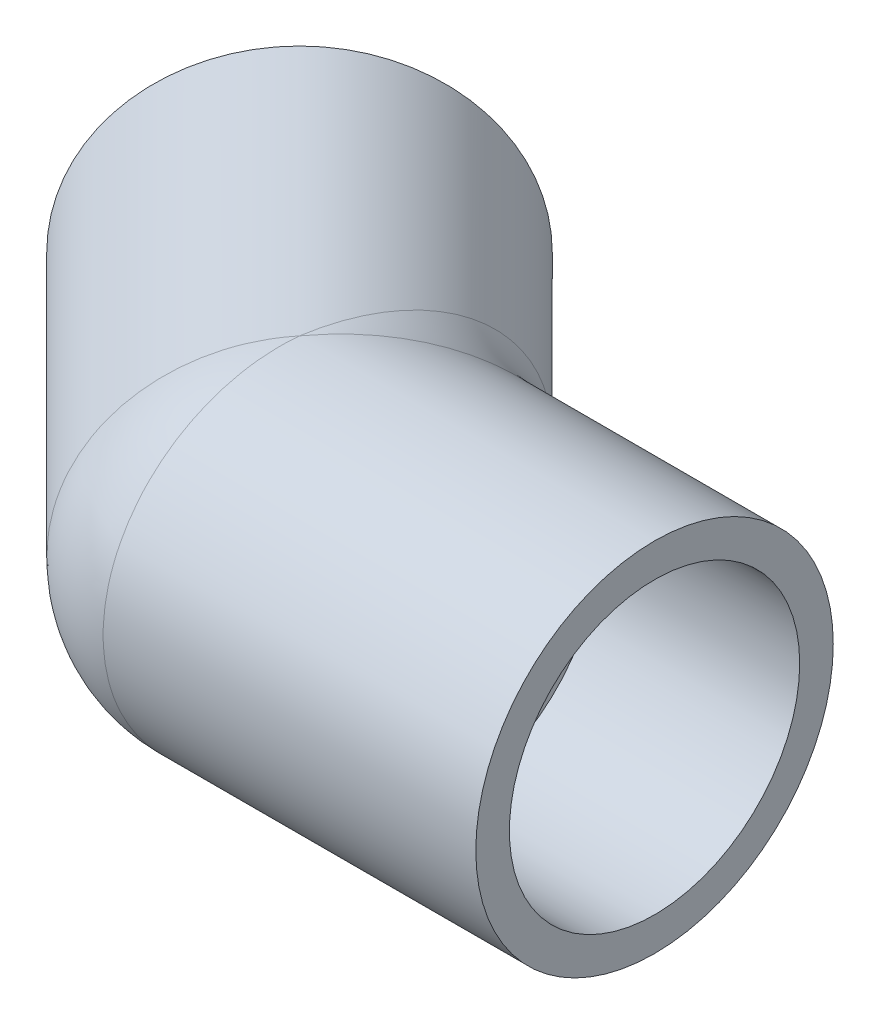
ISO-10303-21;
HEADER;
FILE_DESCRIPTION(('STEP AP214'),'2;1');
FILE_NAME('part.step','',(''),(''),'','','');
FILE_SCHEMA(('AUTOMOTIVE_DESIGN { 1 0 10303 214 1 1 1 1 }'));
ENDSEC;
DATA;
#1=APPLICATION_CONTEXT('core data for automotive mechanical design processes');
#2=APPLICATION_PROTOCOL_DEFINITION('international standard','automotive_design',2000,#1);
#3=PRODUCT_CONTEXT('',#1,'mechanical');
#4=PRODUCT('Part','Part','',(#3));
#5=PRODUCT_RELATED_PRODUCT_CATEGORY('part','',(#4));
#6=PRODUCT_DEFINITION_FORMATION('','',#4);
#7=PRODUCT_DEFINITION_CONTEXT('part definition',#1,'design');
#8=PRODUCT_DEFINITION('design','',#6,#7);
#9=PRODUCT_DEFINITION_SHAPE('','',#8);
#10=(LENGTH_UNIT() NAMED_UNIT(*) SI_UNIT(.MILLI.,.METRE.));
#11=(NAMED_UNIT(*) PLANE_ANGLE_UNIT() SI_UNIT($,.RADIAN.));
#12=(NAMED_UNIT(*) SI_UNIT($,.STERADIAN.) SOLID_ANGLE_UNIT());
#13=UNCERTAINTY_MEASURE_WITH_UNIT(LENGTH_MEASURE(1.E-05),#10,'distance_accuracy_value','');
#14=(GEOMETRIC_REPRESENTATION_CONTEXT(3) GLOBAL_UNCERTAINTY_ASSIGNED_CONTEXT((#13)) GLOBAL_UNIT_ASSIGNED_CONTEXT((#10,
#11,#12)) REPRESENTATION_CONTEXT('',''));
#15=CARTESIAN_POINT('',(0.,0.,0.));
#16=DIRECTION('',(0.,0.,1.));
#17=DIRECTION('',(1.,0.,0.));
#18=AXIS2_PLACEMENT_3D('',#15,#16,#17);
#19=CARTESIAN_POINT('',(-30.4978930912689,0.,-30.497893091269));
#20=DIRECTION('',(0.707106781186546,0.,0.707106781186549));
#21=DIRECTION('',(0.707106781186549,0.,-0.707106781186546));
#22=AXIS2_PLACEMENT_3D('',#19,#20,#21);
#23=CYLINDRICAL_SURFACE('',#22,13.6);
#24=CARTESIAN_POINT('',(0.,0.,0.));
#25=DIRECTION('',(0.923879532511287,0.,0.382683432365091));
#26=DIRECTION('',(-0.382683432365091,0.,0.923879532511287));
#27=AXIS2_PLACEMENT_3D('',#24,#25,#26);
#28=ELLIPSE('',#27,14.7205339239766,13.6);
#29=CARTESIAN_POINT('',(-5.63330444827411,0.,13.6));
#30=VERTEX_POINT('',#29);
#31=EDGE_CURVE('E147',#30,#30,#28,.T.);
#32=ORIENTED_EDGE('',*,*,#31,.T.);
#33=EDGE_LOOP('',(#32));
#34=FACE_BOUND('',#33,.T.);
#35=CARTESIAN_POINT('',(-11.9716954241814,0.,-11.9716954241814));
#36=DIRECTION('',(-0.707106781186546,0.,-0.707106781186549));
#37=DIRECTION('',(-0.707106781186549,0.,0.707106781186546));
#38=AXIS2_PLACEMENT_3D('',#35,#36,#37);
#39=CIRCLE('',#38,13.6);
#40=CARTESIAN_POINT('',(-21.5883476483184,0.,-2.3550432000444));
#41=VERTEX_POINT('',#40);
#42=EDGE_CURVE('E131',#41,#41,#39,.T.);
#43=ORIENTED_EDGE('',*,*,#42,.T.);
#44=EDGE_LOOP('',(#43));
#45=FACE_BOUND('',#44,.T.);
#46=ADVANCED_FACE('F53',(#34,#45),#23,.F.);
#47=CARTESIAN_POINT('',(-6.29663489310152,0.,0.));
#48=DIRECTION('',(1.,0.,0.));
#49=DIRECTION('',(0.,0.,-1.));
#50=AXIS2_PLACEMENT_3D('',#47,#48,#49);
#51=CYLINDRICAL_SURFACE('',#50,13.6);
#52=ORIENTED_EDGE('',*,*,#31,.F.);
#53=EDGE_LOOP('',(#52));
#54=FACE_BOUND('',#53,.T.);
#55=CARTESIAN_POINT('',(16.9305340334773,0.,0.));
#56=DIRECTION('',(1.,0.,0.));
#57=DIRECTION('',(0.,0.,-1.));
#58=AXIS2_PLACEMENT_3D('',#55,#56,#57);
#59=CIRCLE('',#58,13.6);
#60=CARTESIAN_POINT('',(16.9305340334773,0.,-13.6));
#61=VERTEX_POINT('',#60);
#62=EDGE_CURVE('E144',#61,#61,#59,.T.);
#63=ORIENTED_EDGE('',*,*,#62,.T.);
#64=EDGE_LOOP('',(#63));
#65=FACE_BOUND('',#64,.T.);
#66=ADVANCED_FACE('F105',(#54,#65),#51,.F.);
#67=CARTESIAN_POINT('',(39.1305340334773,0.,0.));
#68=DIRECTION('',(-1.,0.,0.));
#69=DIRECTION('',(0.,0.,1.));
#70=AXIS2_PLACEMENT_3D('',#67,#68,#69);
#71=PLANE('',#70);
#72=CARTESIAN_POINT('',(39.1305340334773,0.,0.));
#73=DIRECTION('',(1.,0.,0.));
#74=DIRECTION('',(0.,0.,-1.));
#75=AXIS2_PLACEMENT_3D('',#72,#73,#74);
#76=CIRCLE('',#75,16.);
#77=CARTESIAN_POINT('',(39.1305340334773,0.,-16.));
#78=VERTEX_POINT('',#77);
#79=EDGE_CURVE('E137',#78,#78,#76,.T.);
#80=ORIENTED_EDGE('',*,*,#79,.F.);
#81=EDGE_LOOP('',(#80));
#82=FACE_BOUND('',#81,.T.);
#83=CARTESIAN_POINT('',(39.1305340334773,0.,0.));
#84=DIRECTION('',(-1.,0.,0.));
#85=DIRECTION('',(0.,0.,1.));
#86=AXIS2_PLACEMENT_3D('',#83,#84,#85);
#87=CIRCLE('',#86,19.7);
#88=CARTESIAN_POINT('',(39.1305340334773,0.,19.7));
#89=VERTEX_POINT('',#88);
#90=EDGE_CURVE('E150',#89,#89,#87,.T.);
#91=ORIENTED_EDGE('',*,*,#90,.F.);
#92=EDGE_LOOP('',(#91));
#93=FACE_BOUND('',#92,.T.);
#94=ADVANCED_FACE('F97',(#82,#93),#71,.F.);
#95=CARTESIAN_POINT('',(-27.6694659665227,0.,-27.6694659665228));
#96=DIRECTION('',(-0.707106781186546,0.,-0.707106781186549));
#97=DIRECTION('',(-0.707106781186549,0.,0.707106781186546));
#98=AXIS2_PLACEMENT_3D('',#95,#96,#97);
#99=PLANE('',#98);
#100=CARTESIAN_POINT('',(-27.6694659665227,0.,-27.6694659665228));
#101=DIRECTION('',(-0.707106781186546,0.,-0.707106781186549));
#102=DIRECTION('',(-0.707106781186549,0.,0.707106781186546));
#103=AXIS2_PLACEMENT_3D('',#100,#101,#102);
#104=CIRCLE('',#103,16.);
#105=CARTESIAN_POINT('',(-38.9831744655075,0.,-16.3557574675381));
#106=VERTEX_POINT('',#105);
#107=EDGE_CURVE('E135',#106,#106,#104,.T.);
#108=ORIENTED_EDGE('',*,*,#107,.F.);
#109=EDGE_LOOP('',(#108));
#110=FACE_BOUND('',#109,.T.);
#111=CARTESIAN_POINT('',(-27.6694659665227,0.,-27.6694659665228));
#112=DIRECTION('',(-0.707106781186546,0.,-0.707106781186549));
#113=DIRECTION('',(-0.707106781186549,0.,0.707106781186546));
#114=AXIS2_PLACEMENT_3D('',#111,#112,#113);
#115=CIRCLE('',#114,19.7);
#116=CARTESIAN_POINT('',(-41.5994695558977,0.,-13.7394623771478));
#117=VERTEX_POINT('',#116);
#118=EDGE_CURVE('E86',#117,#117,#115,.T.);
#119=ORIENTED_EDGE('',*,*,#118,.T.);
#120=EDGE_LOOP('',(#119));
#121=FACE_BOUND('',#120,.T.);
#122=ADVANCED_FACE('F165',(#110,#121),#99,.T.);
#123=CARTESIAN_POINT('',(-9.07600789662499,0.,0.));
#124=DIRECTION('',(1.,0.,0.));
#125=DIRECTION('',(0.,0.,-1.));
#126=AXIS2_PLACEMENT_3D('',#123,#124,#125);
#127=CYLINDRICAL_SURFACE('',#126,19.7);
#128=CARTESIAN_POINT('',(0.,0.,0.));
#129=DIRECTION('',(-0.995152530414869,0.,-0.0983434858487509));
#130=DIRECTION('',(0.0983434858487509,0.,-0.995152530414869));
#131=AXIS2_PLACEMENT_3D('',#128,#129,#130);
#132=ELLIPSE('',#131,19.795960315538,19.7);
#133=CARTESIAN_POINT('',(0.,19.7,0.));
#134=VERTEX_POINT('',#133);
#135=CARTESIAN_POINT('',(0.,-19.7,0.));
#136=VERTEX_POINT('',#135);
#137=EDGE_CURVE('E77',#134,#136,#132,.F.);
#138=ORIENTED_EDGE('',*,*,#137,.T.);
#139=CARTESIAN_POINT('',(0.,0.,0.));
#140=DIRECTION('',(-0.807839078546781,0.,-0.589403107535656));
#141=DIRECTION('',(0.589403107535656,0.,-0.807839078546781));
#142=AXIS2_PLACEMENT_3D('',#139,#140,#141);
#143=ELLIPSE('',#142,24.3860448487318,19.7);
#144=EDGE_CURVE('E81',#136,#134,#143,.F.);
#145=ORIENTED_EDGE('',*,*,#144,.T.);
#146=EDGE_LOOP('',(#138,#145));
#147=FACE_BOUND('',#146,.T.);
#148=ORIENTED_EDGE('',*,*,#90,.T.);
#149=EDGE_LOOP('',(#148));
#150=FACE_BOUND('',#149,.T.);
#151=ADVANCED_FACE('F84',(#147,#150),#127,.T.);
#152=CARTESIAN_POINT('',(-27.6694659665227,0.,-27.6694659665228));
#153=DIRECTION('',(0.707106781186546,0.,0.707106781186549));
#154=DIRECTION('',(0.707106781186549,0.,-0.707106781186546));
#155=AXIS2_PLACEMENT_3D('',#152,#153,#154);
#156=CYLINDRICAL_SURFACE('',#155,19.7);
#157=ORIENTED_EDGE('',*,*,#118,.F.);
#158=EDGE_LOOP('',(#157));
#159=FACE_BOUND('',#158,.T.);
#160=CARTESIAN_POINT('',(0.,0.,0.));
#161=DIRECTION('',(-0.987999424738807,0.,-0.154457556357036));
#162=DIRECTION('',(0.154457556357036,0.,-0.987999424738807));
#163=AXIS2_PLACEMENT_3D('',#160,#161,#162);
#164=ELLIPSE('',#163,24.3860448487318,19.7);
#165=EDGE_CURVE('E66',#134,#136,#164,.T.);
#166=ORIENTED_EDGE('',*,*,#165,.T.);
#167=CARTESIAN_POINT('',(0.,0.,0.));
#168=DIRECTION('',(-0.77321844830048,0.,-0.634139756842132));
#169=DIRECTION('',(0.634139756842132,0.,-0.77321844830048));
#170=AXIS2_PLACEMENT_3D('',#167,#168,#169);
#171=ELLIPSE('',#170,19.795960315538,19.7);
#172=EDGE_CURVE('E12',#136,#134,#171,.T.);
#173=ORIENTED_EDGE('',*,*,#172,.T.);
#174=EDGE_LOOP('',(#166,#173));
#175=FACE_BOUND('',#174,.T.);
#176=ADVANCED_FACE('F80',(#159,#175),#156,.T.);
#177=CARTESIAN_POINT('',(16.9305340334773,0.,0.));
#178=DIRECTION('',(1.,0.,0.));
#179=DIRECTION('',(0.,0.,-1.));
#180=AXIS2_PLACEMENT_3D('',#177,#178,#179);
#181=CYLINDRICAL_SURFACE('',#180,16.);
#182=CARTESIAN_POINT('',(16.9305340334773,0.,0.));
#183=DIRECTION('',(1.,0.,0.));
#184=DIRECTION('',(0.,0.,-1.));
#185=AXIS2_PLACEMENT_3D('',#182,#183,#184);
#186=CIRCLE('',#185,16.);
#187=CARTESIAN_POINT('',(16.9305340334773,0.,-16.));
#188=VERTEX_POINT('',#187);
#189=EDGE_CURVE('E141',#188,#188,#186,.T.);
#190=ORIENTED_EDGE('',*,*,#189,.F.);
#191=EDGE_LOOP('',(#190));
#192=FACE_BOUND('',#191,.T.);
#193=ORIENTED_EDGE('',*,*,#79,.T.);
#194=EDGE_LOOP('',(#193));
#195=FACE_BOUND('',#194,.T.);
#196=ADVANCED_FACE('F103',(#192,#195),#181,.F.);
#197=CARTESIAN_POINT('',(16.9305340334773,0.,0.));
#198=DIRECTION('',(1.,0.,0.));
#199=DIRECTION('',(0.,0.,-1.));
#200=AXIS2_PLACEMENT_3D('',#197,#198,#199);
#201=PLANE('',#200);
#202=ORIENTED_EDGE('',*,*,#62,.F.);
#203=EDGE_LOOP('',(#202));
#204=FACE_BOUND('',#203,.T.);
#205=ORIENTED_EDGE('',*,*,#189,.T.);
#206=EDGE_LOOP('',(#205));
#207=FACE_BOUND('',#206,.T.);
#208=ADVANCED_FACE('F115',(#204,#207),#201,.T.);
#209=CARTESIAN_POINT('',(-11.9716954241814,0.,-11.9716954241814));
#210=DIRECTION('',(-0.707106781186546,0.,-0.707106781186549));
#211=DIRECTION('',(-0.707106781186549,0.,0.707106781186546));
#212=AXIS2_PLACEMENT_3D('',#209,#210,#211);
#213=CYLINDRICAL_SURFACE('',#212,16.);
#214=CARTESIAN_POINT('',(-11.9716954241814,0.,-11.9716954241814));
#215=DIRECTION('',(-0.707106781186546,0.,-0.707106781186549));
#216=DIRECTION('',(-0.707106781186549,0.,0.707106781186546));
#217=AXIS2_PLACEMENT_3D('',#214,#215,#216);
#218=CIRCLE('',#217,16.);
#219=CARTESIAN_POINT('',(-23.2854039231662,0.,-0.657986925196682));
#220=VERTEX_POINT('',#219);
#221=EDGE_CURVE('E134',#220,#220,#218,.T.);
#222=ORIENTED_EDGE('',*,*,#221,.F.);
#223=EDGE_LOOP('',(#222));
#224=FACE_BOUND('',#223,.T.);
#225=ORIENTED_EDGE('',*,*,#107,.T.);
#226=EDGE_LOOP('',(#225));
#227=FACE_BOUND('',#226,.T.);
#228=ADVANCED_FACE('F119',(#224,#227),#213,.F.);
#229=CARTESIAN_POINT('',(-11.9716954241814,0.,-11.9716954241814));
#230=DIRECTION('',(-0.707106781186546,0.,-0.707106781186549));
#231=DIRECTION('',(-0.707106781186549,0.,0.707106781186546));
#232=AXIS2_PLACEMENT_3D('',#229,#230,#231);
#233=PLANE('',#232);
#234=ORIENTED_EDGE('',*,*,#42,.F.);
#235=EDGE_LOOP('',(#234));
#236=FACE_BOUND('',#235,.T.);
#237=ORIENTED_EDGE('',*,*,#221,.T.);
#238=EDGE_LOOP('',(#237));
#239=FACE_BOUND('',#238,.T.);
#240=ADVANCED_FACE('F96',(#236,#239),#233,.T.);
#241=CARTESIAN_POINT('',(0.,-19.7,0.));
#242=CARTESIAN_POINT('',(0.,-19.7,0.));
#243=CARTESIAN_POINT('',(0.,-19.7,0.));
#244=CARTESIAN_POINT('',(0.313491029375796,-19.6999915322969,-0.429672495895844));
#245=CARTESIAN_POINT('',(0.197822347215158,-19.7000329813767,-0.477585393587278));
#246=CARTESIAN_POINT('',(0.0821527028245505,-19.6999915322969,-0.525495968250062));
#247=CARTESIAN_POINT('',(0.626904468452524,-19.6859389928598,-0.85923864610927));
#248=CARTESIAN_POINT('',(0.395635126558962,-19.6827962420883,-0.955147688289801));
#249=CARTESIAN_POINT('',(0.164285072522513,-19.6859389928598,-1.05086187412033));
#250=CARTESIAN_POINT('',(1.25259493437993,-19.6297570584687,-1.71681337380906));
#251=CARTESIAN_POINT('',(0.790030957919722,-19.6141329914077,-1.90730345330436));
#252=CARTESIAN_POINT('',(0.328252006472205,-19.6297570584687,-2.0996887508321));
#253=CARTESIAN_POINT('',(1.56487192619534,-19.5876268051636,-2.1448219032759));
#254=CARTESIAN_POINT('',(0.986695315594989,-19.5626769138762,-2.38209321283938));
#255=CARTESIAN_POINT('',(0.410086561542676,-19.5876268051636,-2.62314966294499));
#256=CARTESIAN_POINT('',(2.49666134930779,-19.4194690628214,-3.4219375128526));
#257=CARTESIAN_POINT('',(1.57232907424296,-19.3576774873838,-3.79593817555084));
#258=CARTESIAN_POINT('',(0.654269049712836,-19.4194690628214,-4.18508139055658));
#259=CARTESIAN_POINT('',(3.11299355989891,-19.251673914623,-4.26668576530818));
#260=CARTESIAN_POINT('',(1.95810186316317,-19.1533123398743,-4.7272760745565));
#261=CARTESIAN_POINT('',(0.815783581846986,-19.251673914623,-5.21822129383609));
#262=CARTESIAN_POINT('',(4.32420338888311,-18.8068775570264,-5.92677649042233));
#263=CARTESIAN_POINT('',(2.70902958727469,-18.61750461104,-6.5401759704685));
#264=CARTESIAN_POINT('',(1.13319030744557,-18.8068775570264,-7.24853738646372));
#265=CARTESIAN_POINT('',(4.91917005558575,-18.5304063052031,-6.74224101317432));
#266=CARTESIAN_POINT('',(3.07478319368247,-18.2858619257181,-7.42318328754504));
#267=CARTESIAN_POINT('',(1.28910583669517,-18.5304063052031,-8.2458628449241));
#268=CARTESIAN_POINT('',(6.07760695397123,-17.8727194334152,-8.33000087494211));
#269=CARTESIAN_POINT('',(3.77726055758574,-17.5084329701658,-9.11911366674039));
#270=CARTESIAN_POINT('',(1.5926830154219,-17.8727194334152,-10.187717196501));
#271=CARTESIAN_POINT('',(6.64126585283476,-17.4922381658726,-9.10255480221346));
#272=CARTESIAN_POINT('',(4.11450485710924,-17.0624054497517,-9.93329342848305));
#273=CARTESIAN_POINT('',(1.74039410656523,-17.4922381658726,-11.1325623469694));
#274=CARTESIAN_POINT('',(7.72727784423491,-16.6328557655977,-10.5910486957927));
#275=CARTESIAN_POINT('',(4.7529531337715,-16.0730591798112,-11.4746439168748));
#276=CARTESIAN_POINT('',(2.02499178890092,-16.6328557655977,-12.953012916443));
#277=CARTESIAN_POINT('',(8.24994314416681,-16.1548247574647,-11.3074165752407));
#278=CARTESIAN_POINT('',(5.05457761852207,-15.5295244124331,-12.2028298387034));
#279=CARTESIAN_POINT('',(2.16196019641007,-16.1548247574647,-13.8291416796976));
#280=CARTESIAN_POINT('',(9.24491209112817,-15.1084052516723,-12.6711263810077));
#281=CARTESIAN_POINT('',(5.61679836619131,-14.3646581018175,-13.560150792774));
#282=CARTESIAN_POINT('',(2.4226993581721,-15.1084052516722,-15.4969794203925));
#283=CARTESIAN_POINT('',(9.71765571807789,-14.5409398088111,-13.3190713461788));
#284=CARTESIAN_POINT('',(5.87770191659894,-13.7432154683027,-14.1900276826394));
#285=CARTESIAN_POINT('',(2.5465854125014,-14.5409398088111,-16.2894259234795));
#286=CARTESIAN_POINT('',(10.6045603604317,-13.3253356101763,-14.5346676331303));
#287=CARTESIAN_POINT('',(6.35570611127207,-12.4429892526184,-15.3440318922905));
#288=CARTESIAN_POINT('',(2.77900550331573,-13.3253356101763,-17.7761185880424));
#289=CARTESIAN_POINT('',(11.0192726716138,-12.6780843035507,-15.1030745638776));
#290=CARTESIAN_POINT('',(6.57299961751486,-11.7642823864833,-15.8686248220775));
#291=CARTESIAN_POINT('',(2.88768401104226,-12.6780843035507,-18.4712888707256));
#292=CARTESIAN_POINT('',(11.7829143958448,-11.3140505349014,-16.149726030345));
#293=CARTESIAN_POINT('',(6.96324502415899,-10.3689729855679,-16.8107605754515));
#294=CARTESIAN_POINT('',(3.08780211891949,-11.3140505349014,-19.7513594618043));
#295=CARTESIAN_POINT('',(12.1324668446357,-10.5980377069435,-16.6288245022138));
#296=CARTESIAN_POINT('',(7.13628715003177,-9.65270728105979,-17.2285212225955));
#297=CARTESIAN_POINT('',(3.17940499031357,-10.5980377069435,-20.3373041470392));
#298=CARTESIAN_POINT('',(12.7597488183927,-9.10888336560532,-17.4885805591297));
#299=CARTESIAN_POINT('',(7.43940726405634,-8.19872243468261,-17.9603179129017));
#300=CARTESIAN_POINT('',(3.34378899096538,-9.10888336560532,-21.3887988224103));
#301=CARTESIAN_POINT('',(13.0381129474261,-8.33633171858677,-17.8701079359347));
#302=CARTESIAN_POINT('',(7.56949670069587,-7.46164639115613,-18.2743815951583));
#303=CARTESIAN_POINT('',(3.41673642303393,-8.33633171858677,-21.855412581036));
#304=CARTESIAN_POINT('',(13.5182639045513,-6.7475282037452,-18.528205427801));
#305=CARTESIAN_POINT('',(7.78934155745646,-5.97790426015083,-18.8051340299677));
#306=CARTESIAN_POINT('',(3.54256362443797,-6.7475282037452,-22.660275777993));
#307=CARTESIAN_POINT('',(13.7206231649924,-5.93165808728569,-18.8055601217279));
#308=CARTESIAN_POINT('',(7.8790617555695,-5.23219376163374,-19.021737749071));
#309=CARTESIAN_POINT('',(3.59559340401384,-5.93165808728569,-22.9994847681565));
#310=CARTESIAN_POINT('',(14.0453892687233,-4.27040701058289,-19.2506862953549));
#311=CARTESIAN_POINT('',(8.02111690292659,-3.73781693222191,-19.3646892124254));
#312=CARTESIAN_POINT('',(3.68070082562145,-4.27040701058289,-23.5438808182594));
#313=CARTESIAN_POINT('',(14.1682310021951,-3.42521367073582,-19.4190538378843));
#314=CARTESIAN_POINT('',(8.073403997487,-2.99037742711563,-19.4909214252502));
#315=CARTESIAN_POINT('',(3.71289243392507,-3.42521367073582,-23.7497968720643));
#316=CARTESIAN_POINT('',(14.3320241223374,-1.71998032940987,-19.6435495718842));
#317=CARTESIAN_POINT('',(8.14286514812032,-1.49459711519922,-19.6586154771672));
#318=CARTESIAN_POINT('',(3.75581566381953,-1.71998032940987,-24.0243585538873));
#319=CARTESIAN_POINT('',(14.3732106143464,-0.859990164704934,-19.7));
#320=CARTESIAN_POINT('',(8.16000717875,-0.74766781214451,-19.7));
#321=CARTESIAN_POINT('',(3.76660889654821,-0.859990164704934,-24.0933982822018));
#322=CARTESIAN_POINT('',(14.3732106143464,0.859990164704934,-19.7));
#323=CARTESIAN_POINT('',(8.16000717875,0.74766781214451,-19.7));
#324=CARTESIAN_POINT('',(3.76660889654821,0.859990164704934,-24.0933982822018));
#325=CARTESIAN_POINT('',(14.3320241223374,1.71998032940987,-19.6435495718842));
#326=CARTESIAN_POINT('',(8.14286514812032,1.49459711519922,-19.6586154771672));
#327=CARTESIAN_POINT('',(3.75581566381953,1.71998032940987,-24.0243585538873));
#328=CARTESIAN_POINT('',(14.1682310021951,3.42521367073582,-19.4190538378843));
#329=CARTESIAN_POINT('',(8.073403997487,2.99037742711563,-19.4909214252502));
#330=CARTESIAN_POINT('',(3.71289243392507,3.42521367073582,-23.7497968720643));
#331=CARTESIAN_POINT('',(14.0453892687233,4.27040701058288,-19.2506862953549));
#332=CARTESIAN_POINT('',(8.02111690292659,3.7378169322219,-19.3646892124254));
#333=CARTESIAN_POINT('',(3.68070082562145,4.27040701058287,-23.5438808182594));
#334=CARTESIAN_POINT('',(13.7206231649924,5.93165808728568,-18.805560121728));
#335=CARTESIAN_POINT('',(7.8790617555695,5.23219376163373,-19.021737749071));
#336=CARTESIAN_POINT('',(3.59559340401385,5.93165808728568,-22.9994847681565));
#337=CARTESIAN_POINT('',(13.5182639045513,6.7475282037452,-18.528205427801));
#338=CARTESIAN_POINT('',(7.78934155745647,5.97790426015083,-18.8051340299677));
#339=CARTESIAN_POINT('',(3.54256362443798,6.7475282037452,-22.660275777993));
#340=CARTESIAN_POINT('',(13.0381129474261,8.33633171858677,-17.8701079359347));
#341=CARTESIAN_POINT('',(7.56949670069587,7.46164639115613,-18.2743815951583));
#342=CARTESIAN_POINT('',(3.41673642303394,8.33633171858677,-21.855412581036));
#343=CARTESIAN_POINT('',(12.7597488183927,9.10888336560532,-17.4885805591297));
#344=CARTESIAN_POINT('',(7.43940726405634,8.1987224346826,-17.9603179129017));
#345=CARTESIAN_POINT('',(3.34378899096538,9.10888336560532,-21.3887988224103));
#346=CARTESIAN_POINT('',(12.1324668446357,10.5980377069435,-16.6288245022138));
#347=CARTESIAN_POINT('',(7.13628715003177,9.65270728105979,-17.2285212225955));
#348=CARTESIAN_POINT('',(3.17940499031357,10.5980377069435,-20.3373041470392));
#349=CARTESIAN_POINT('',(11.7829143958448,11.3140505349014,-16.149726030345));
#350=CARTESIAN_POINT('',(6.963245024159,10.3689729855679,-16.8107605754515));
#351=CARTESIAN_POINT('',(3.08780211891948,11.3140505349014,-19.7513594618043));
#352=CARTESIAN_POINT('',(11.0192726716138,12.6780843035507,-15.1030745638776));
#353=CARTESIAN_POINT('',(6.57299961751486,11.7642823864833,-15.8686248220775));
#354=CARTESIAN_POINT('',(2.88768401104226,12.6780843035507,-18.4712888707256));
#355=CARTESIAN_POINT('',(10.6045603604318,13.3253356101763,-14.5346676331303));
#356=CARTESIAN_POINT('',(6.35570611127207,12.4429892526184,-15.3440318922905));
#357=CARTESIAN_POINT('',(2.77900550331573,13.3253356101763,-17.7761185880424));
#358=CARTESIAN_POINT('',(9.7176557180779,14.5409398088111,-13.3190713461788));
#359=CARTESIAN_POINT('',(5.87770191659894,13.7432154683027,-14.1900276826394));
#360=CARTESIAN_POINT('',(2.5465854125014,14.5409398088111,-16.2894259234796));
#361=CARTESIAN_POINT('',(9.24491209112818,15.1084052516722,-12.6711263810077));
#362=CARTESIAN_POINT('',(5.61679836619131,14.3646581018175,-13.5601507927741));
#363=CARTESIAN_POINT('',(2.42269935817211,15.1084052516722,-15.4969794203925));
#364=CARTESIAN_POINT('',(8.24994314416682,16.1548247574647,-11.3074165752407));
#365=CARTESIAN_POINT('',(5.05457761852208,15.5295244124331,-12.2028298387034));
#366=CARTESIAN_POINT('',(2.16196019641007,16.1548247574647,-13.8291416796977));
#367=CARTESIAN_POINT('',(7.72727784423491,16.6328557655977,-10.5910486957927));
#368=CARTESIAN_POINT('',(4.7529531337715,16.0730591798112,-11.4746439168748));
#369=CARTESIAN_POINT('',(2.02499178890093,16.6328557655977,-12.953012916443));
#370=CARTESIAN_POINT('',(6.64126585283476,17.4922381658726,-9.10255480221346));
#371=CARTESIAN_POINT('',(4.11450485710925,17.0624054497517,-9.93329342848306));
#372=CARTESIAN_POINT('',(1.74039410656523,17.4922381658726,-11.1325623469694));
#373=CARTESIAN_POINT('',(6.07760695397123,17.8727194334152,-8.33000087494212));
#374=CARTESIAN_POINT('',(3.77726055758574,17.5084329701657,-9.1191136667404));
#375=CARTESIAN_POINT('',(1.5926830154219,17.8727194334152,-10.187717196501));
#376=CARTESIAN_POINT('',(4.91917005558576,18.5304063052031,-6.74224101317433));
#377=CARTESIAN_POINT('',(3.07478319368248,18.2858619257181,-7.42318328754505));
#378=CARTESIAN_POINT('',(1.28910583669517,18.5304063052031,-8.24586284492411));
#379=CARTESIAN_POINT('',(4.32420338888312,18.8068775570264,-5.92677649042234));
#380=CARTESIAN_POINT('',(2.70902958727469,18.61750461104,-6.54017597046851));
#381=CARTESIAN_POINT('',(1.13319030744557,18.8068775570264,-7.24853738646373));
#382=CARTESIAN_POINT('',(3.11299355989892,19.251673914623,-4.26668576530819));
#383=CARTESIAN_POINT('',(1.95810186316317,19.1533123398743,-4.72727607455651));
#384=CARTESIAN_POINT('',(0.815783581846989,19.251673914623,-5.2182212938361));
#385=CARTESIAN_POINT('',(2.49666134930779,19.4194690628214,-3.4219375128526));
#386=CARTESIAN_POINT('',(1.57232907424296,19.3576774873838,-3.79593817555085));
#387=CARTESIAN_POINT('',(0.654269049712841,19.4194690628214,-4.18508139055659));
#388=CARTESIAN_POINT('',(1.56487192619534,19.5876268051636,-2.14482190327591));
#389=CARTESIAN_POINT('',(0.986695315594993,19.5626769138762,-2.38209321283939));
#390=CARTESIAN_POINT('',(0.410086561542679,19.5876268051636,-2.623149662945));
#391=CARTESIAN_POINT('',(1.25259493437994,19.6297570584687,-1.71681337380907));
#392=CARTESIAN_POINT('',(0.790030957919725,19.6141329914077,-1.90730345330437));
#393=CARTESIAN_POINT('',(0.328252006472206,19.6297570584687,-2.09968875083211));
#394=CARTESIAN_POINT('',(0.626904468452529,19.6859389928598,-0.859238646109278));
#395=CARTESIAN_POINT('',(0.395635126558964,19.6827962420883,-0.955147688289809));
#396=CARTESIAN_POINT('',(0.164285072522513,19.6859389928598,-1.05086187412034));
#397=CARTESIAN_POINT('',(0.313491029375801,19.6999915322969,-0.429672495895851));
#398=CARTESIAN_POINT('',(0.197822347215161,19.7000329813767,-0.477585393587285));
#399=CARTESIAN_POINT('',(0.0821527028245502,19.6999915322969,-0.525495968250071));
#400=CARTESIAN_POINT('',(0.,19.7,0.));
#401=CARTESIAN_POINT('',(0.,19.7,0.));
#402=CARTESIAN_POINT('',(0.,19.7,0.));
#403=(BOUNDED_SURFACE() B_SPLINE_SURFACE(3,2,((#241,#242,#243),(#244,#245,#246),(#247,#248,
#249),(#250,#251,#252),(#253,#254,#255),(#256,#257,#258),(#259,#260,#261),(#262,#263,#264),
(#265,#266,#267),(#268,#269,#270),(#271,#272,#273),(#274,#275,#276),(#277,#278,#279),(#280,#281,
#282),(#283,#284,#285),(#286,#287,#288),(#289,#290,#291),(#292,#293,#294),(#295,#296,#297),
(#298,#299,#300),(#301,#302,#303),(#304,#305,#306),(#307,#308,#309),(#310,#311,#312),(#313,#314,
#315),(#316,#317,#318),(#319,#320,#321),(#322,#323,#324),(#325,#326,#327),(#328,#329,#330),
(#331,#332,#333),(#334,#335,#336),(#337,#338,#339),(#340,#341,#342),(#343,#344,#345),(#346,#347,
#348),(#349,#350,#351),(#352,#353,#354),(#355,#356,#357),(#358,#359,#360),(#361,#362,#363),
(#364,#365,#366),(#367,#368,#369),(#370,#371,#372),(#373,#374,#375),(#376,#377,#378),(#379,#380,
#381),(#382,#383,#384),(#385,#386,#387),(#388,#389,#390),(#391,#392,#393),(#394,#395,#396),
(#397,#398,#399),(#400,#401,#402)),.UNSPECIFIED.,.F.,.F.,.F.) B_SPLINE_SURFACE_WITH_KNOTS((4,2,
2,2,2,2,2,2,2,2,2,2,2,2,2,2,2,2,2,2,2,2,2,2,2,2,4),(3,3),(0.,2.45679397394339,4.91366305687832,
9.81290551828127,14.6885475088965,19.5306170294991,24.3312489872748,29.0852372828151,
33.790449389002,38.4480623489121,43.0625816560549,47.6416143986426,52.1953874477446,
56.736029922235,61.2766723967253,65.8304454458273,70.409478188415,75.0239974955578,
79.6816104554679,84.3868225616548,89.1408108571951,93.9414428149709,98.7835123355734,
103.659154326189,108.558396787592,111.015265870527,113.47205984447),(0.,1.),
.UNSPECIFIED.) GEOMETRIC_REPRESENTATION_ITEM() RATIONAL_B_SPLINE_SURFACE(((1.,1.,1.),(1.,
1.00000023984464,1.),(1.,0.999895433309748,1.),(1.,0.999478437253579,1.),(1.,0.999166241392298,
1.),(1.,0.997925090234326,1.),(1.,0.996691537200267,1.),(1.,0.993481971218475,1.),(1.,
0.991509563449115,1.),(1.,0.986943363212274,1.),(1.,0.984353942965755,1.),(1.,0.978717245570563,
1.),(1.,0.975674076318715,1.),(1.,0.969328143194752,1.),(1.,0.966028188869087,1.),(1.,
0.959390876072103,1.),(1.,0.956054248751549,1.),(1.,0.949575820796025,1.),(1.,0.94643239070988,
1.),(1.,0.940566037536987,1.),(1.,0.937839492885249,1.),(1.,0.933007850354752,1.),(1.,
0.930898134673108,1.),(1.,0.927458443650692,1.),(1.,0.926124231164033,1.),(1.,0.924336039101393,
1.),(1.,0.923879532511287,1.),(1.,0.923879532511287,1.),(1.,0.924336039101393,1.),(1.,
0.926124231164033,1.),(1.,0.927458443650693,1.),(1.,0.930898134673108,1.),(1.,0.933007850354752,
1.),(1.,0.937839492885249,1.),(1.,0.940566037536987,1.),(1.,0.94643239070988,1.),(1.,
0.949575820796025,1.),(1.,0.956054248751549,1.),(1.,0.959390876072103,1.),(1.,0.966028188869087,
1.),(1.,0.969328143194752,1.),(1.,0.975674076318715,1.),(1.,0.978717245570563,1.),(1.,
0.984353942965755,1.),(1.,0.986943363212274,1.),(1.,0.991509563449115,1.),(1.,0.993481971218475,
1.),(1.,0.996691537200267,1.),(1.,0.997925090234327,1.),(1.,0.999166241392298,1.),(1.,
0.999478437253579,1.),(1.,0.999895433309747,1.),(1.,1.00000023984464,1.),(1.,1.,1.))) REPRESENTATION_ITEM('') SURFACE());
#404=ORIENTED_EDGE('',*,*,#144,.F.);
#405=ORIENTED_EDGE('',*,*,#165,.F.);
#406=EDGE_LOOP('',(#404,#405));
#407=FACE_BOUND('',#406,.T.);
#408=ADVANCED_FACE('F88',(#407),#403,.F.);
#409=CARTESIAN_POINT('',(0.,19.7,0.));
#410=CARTESIAN_POINT('',(0.,19.7,0.));
#411=CARTESIAN_POINT('',(0.,19.7,0.));
#412=CARTESIAN_POINT('',(-0.273799647532905,19.6999915322969,0.333849023541595));
#413=CARTESIAN_POINT('',(-0.158130412904105,19.6999785453213,0.381760587456911));
#414=CARTESIAN_POINT('',(-0.0424613209816879,19.6999915322969,0.429672495895922));
#415=CARTESIAN_POINT('',(-0.547531528544538,19.6859389928598,0.667615418098179));
#416=CARTESIAN_POINT('',(-0.316255045850208,19.6890755665005,0.763507220860675));
#417=CARTESIAN_POINT('',(-0.0849121326145545,19.6859389928598,0.859238646109356));
#418=CARTESIAN_POINT('',(-1.09400276051822,19.6297570584687,1.333937996786));
#419=CARTESIAN_POINT('',(-0.632298409302301,19.6453638651978,1.52650339520467));
#420=CARTESIAN_POINT('',(-0.169659832610498,19.6297570584687,1.71681337380913));
#421=CARTESIAN_POINT('',(-1.36674208088084,19.5876268051636,1.66649414360679));
#422=CARTESIAN_POINT('',(-0.790282642098023,19.6125362578194,1.90791107266113));
#423=CARTESIAN_POINT('',(-0.211956716228164,19.5876268051636,2.14482190327593));
#424=CARTESIAN_POINT('',(-2.18055680512084,19.4194690628214,2.65879363514861));
#425=CARTESIAN_POINT('',(-1.26307503954637,19.4810627944715,3.04933289076771));
#426=CARTESIAN_POINT('',(-0.338164505525842,19.4194690628214,3.42193751285259));
#427=CARTESIAN_POINT('',(-2.71885463890281,19.251673914623,3.31515023678026));
#428=CARTESIAN_POINT('',(-1.57765178571145,19.3493062091915,3.80878833776669));
#429=CARTESIAN_POINT('',(-0.421644660850852,19.251673914623,4.26668576530819));
#430=CARTESIAN_POINT('',(-3.77671209952833,18.8068775570264,4.60501559438092));
#431=CARTESIAN_POINT('',(-2.20197529531568,18.9955451147595,5.31603862196165));
#432=CARTESIAN_POINT('',(-0.585699018090778,18.8068775570264,5.92677649042236));
#433=CARTESIAN_POINT('',(-4.2963495001947,18.5304063052031,5.23861918142453));
#434=CARTESIAN_POINT('',(-2.51220007936982,18.7734186525639,6.0649875030094));
#435=CARTESIAN_POINT('',(-0.666285281304106,18.5304063052031,6.74224101317435));
#436=CARTESIAN_POINT('',(-5.30811565853966,17.8727194334152,6.4722845533832));
#437=CARTESIAN_POINT('',(-3.12504595770081,18.2355020718212,7.54452833412051));
#438=CARTESIAN_POINT('',(-0.823191719990326,17.8727194334152,8.33000087494212));
#439=CARTESIAN_POINT('',(-5.80040919607711,17.4922381658726,7.07254725745749));
#440=CARTESIAN_POINT('',(-3.42808060813544,17.919578645507,8.27611869706878));
#441=CARTESIAN_POINT('',(-0.899537449807575,17.4922381658726,9.10255480221347));
#442=CARTESIAN_POINT('',(-6.74892023020154,16.6328557655978,8.22908447514236));
#443=CARTESIAN_POINT('',(-4.02271744209594,17.1902093437655,9.71169900630282));
#444=CARTESIAN_POINT('',(-1.04663417486754,16.6328557655977,10.5910486957927));
#445=CARTESIAN_POINT('',(-7.20541040532402,16.1548247574647,8.78569147078367));
#446=CARTESIAN_POINT('',(-4.31464831518503,16.7766775945656,10.4164824793899));
#447=CARTESIAN_POINT('',(-1.11742745756725,16.1548247574647,11.3074165752407));
#448=CARTESIAN_POINT('',(-8.07440543694174,15.1084052516722,9.84527334162284));
#449=CARTESIAN_POINT('',(-4.88213707665465,15.8487715771826,11.7865215438242));
#450=CARTESIAN_POINT('',(-1.25219270398565,15.1084052516722,12.6711263810077));
#451=CARTESIAN_POINT('',(-8.4872945671029,14.5409398088111,10.348716768878));
#452=CARTESIAN_POINT('',(-5.15792429598848,15.3344343058614,12.4523307890691));
#453=CARTESIAN_POINT('',(-1.31622426152639,14.5409398088111,13.3190713461788));
#454=CARTESIAN_POINT('',(-9.26190741313991,13.3253356101763,11.2932166782181));
#455=CARTESIAN_POINT('',(-5.6869320257465,14.2035308785097,13.7294684248511));
#456=CARTESIAN_POINT('',(-1.43635255602388,13.3253356101763,14.5346676331303));
#457=CARTESIAN_POINT('',(-9.62411262473824,12.6780843035507,11.7348602570296));
#458=CARTESIAN_POINT('',(-5.94027769811828,13.5872098287203,14.3410989830596));
#459=CARTESIAN_POINT('',(-1.49252396416669,12.6780843035507,15.1030745638776));
#460=CARTESIAN_POINT('',(-10.291068981838,11.3140505349014,12.5480925988857));
#461=CARTESIAN_POINT('',(-6.41709312264704,12.2545300165524,15.4922332477056));
#462=CARTESIAN_POINT('',(-1.59595670491268,11.3140505349014,16.149726030345));
#463=CARTESIAN_POINT('',(-10.5963642799644,10.5980377069435,12.9203448573883));
#464=CARTESIAN_POINT('',(-6.64059153450611,11.5387072824803,16.0318061447846));
#465=CARTESIAN_POINT('',(-1.64330242564228,10.5980377069435,16.6288245022138));
#466=CARTESIAN_POINT('',(-11.1442255175266,9.10888336560533,13.5883622958491));
#467=CARTESIAN_POINT('',(-7.04971206919909,10.0144460679,17.0195104882857));
#468=CARTESIAN_POINT('',(-1.72826569009928,9.10888336560531,17.4885805591297));
#469=CARTESIAN_POINT('',(-11.3873457132366,8.33633171858678,13.8848032908334));
#470=CARTESIAN_POINT('',(-7.23528794665175,9.20689688862873,17.4675302884812));
#471=CARTESIAN_POINT('',(-1.76596918884444,8.33633171858676,17.8701079359347));
#472=CARTESIAN_POINT('',(-11.806704324822,6.74752820374521,14.3961350776089));
#473=CARTESIAN_POINT('',(-7.56063186460337,7.5130658273322,18.2529799876356));
#474=CARTESIAN_POINT('',(-1.83100404470866,6.7475282037452,18.528205427801));
#475=CARTESIAN_POINT('',(-11.9834426968709,5.93165808728569,14.6116354752994));
#476=CARTESIAN_POINT('',(-7.70031241857772,6.62804751518059,18.5901986754402));
#477=CARTESIAN_POINT('',(-1.85841293589233,5.93165808728568,18.8055601217279));
#478=CARTESIAN_POINT('',(-12.2670898714304,4.27040701058288,14.9574917724504));
#479=CARTESIAN_POINT('',(-7.92701825284966,4.79992227776408,19.1375149752087));
#480=CARTESIAN_POINT('',(-1.9024014283285,4.27040701058288,19.2506862953549));
#481=CARTESIAN_POINT('',(-12.374378502285,3.42521367073583,15.0883108037043));
#482=CARTESIAN_POINT('',(-8.01395436763677,3.85841562339139,19.3473973225877));
#483=CARTESIAN_POINT('',(-1.91903993401489,3.42521367073582,19.4190538378843));
#484=CARTESIAN_POINT('',(-12.5174336278258,1.71998032940987,15.262740589881));
#485=CARTESIAN_POINT('',(-8.13047643232868,1.94370214572528,19.6287064714827));
#486=CARTESIAN_POINT('',(-1.94122516930793,1.71998032940987,19.6435495718842));
#487=CARTESIAN_POINT('',(-12.5534054609518,0.859990164704937,15.3066017177982));
#488=CARTESIAN_POINT('',(-8.16000717874998,0.972331283110572,19.7));
#489=CARTESIAN_POINT('',(-1.94680374315354,0.859990164704937,19.7));
#490=CARTESIAN_POINT('',(-12.5534054609518,-0.859990164704934,15.3066017177982));
#491=CARTESIAN_POINT('',(-8.16000717874998,-0.972331283110567,19.7));
#492=CARTESIAN_POINT('',(-1.94680374315354,-0.859990164704933,19.7));
#493=CARTESIAN_POINT('',(-12.5174336278258,-1.71998032940987,15.262740589881));
#494=CARTESIAN_POINT('',(-8.13047643232868,-1.94370214572528,19.6287064714827));
#495=CARTESIAN_POINT('',(-1.94122516930793,-1.71998032940987,19.6435495718842));
#496=CARTESIAN_POINT('',(-12.374378502285,-3.42521367073582,15.0883108037044));
#497=CARTESIAN_POINT('',(-8.01395436763677,-3.85841562339138,19.3473973225877));
#498=CARTESIAN_POINT('',(-1.91903993401489,-3.42521367073582,19.4190538378843));
#499=CARTESIAN_POINT('',(-12.2670898714304,-4.27040701058288,14.9574917724504));
#500=CARTESIAN_POINT('',(-7.92701825284966,-4.79992227776407,19.1375149752087));
#501=CARTESIAN_POINT('',(-1.9024014283285,-4.27040701058287,19.2506862953549));
#502=CARTESIAN_POINT('',(-11.9834426968709,-5.93165808728568,14.6116354752994));
#503=CARTESIAN_POINT('',(-7.70031241857772,-6.62804751518058,18.5901986754402));
#504=CARTESIAN_POINT('',(-1.85841293589233,-5.93165808728568,18.8055601217279));
#505=CARTESIAN_POINT('',(-11.806704324822,-6.74752820374521,14.3961350776089));
#506=CARTESIAN_POINT('',(-7.56063186460337,-7.5130658273322,18.2529799876356));
#507=CARTESIAN_POINT('',(-1.83100404470866,-6.74752820374519,18.528205427801));
#508=CARTESIAN_POINT('',(-11.3873457132366,-8.33633171858678,13.8848032908334));
#509=CARTESIAN_POINT('',(-7.23528794665175,-9.20689688862873,17.4675302884812));
#510=CARTESIAN_POINT('',(-1.76596918884444,-8.33633171858676,17.8701079359347));
#511=CARTESIAN_POINT('',(-11.1442255175266,-9.10888336560532,13.5883622958491));
#512=CARTESIAN_POINT('',(-7.0497120691991,-10.0144460679,17.0195104882858));
#513=CARTESIAN_POINT('',(-1.72826569009928,-9.10888336560531,17.4885805591297));
#514=CARTESIAN_POINT('',(-10.5963642799644,-10.5980377069435,12.9203448573883));
#515=CARTESIAN_POINT('',(-6.64059153450611,-11.5387072824803,16.0318061447846));
#516=CARTESIAN_POINT('',(-1.64330242564228,-10.5980377069435,16.6288245022138));
#517=CARTESIAN_POINT('',(-10.291068981838,-11.3140505349014,12.5480925988857));
#518=CARTESIAN_POINT('',(-6.41709312264703,-12.2545300165524,15.4922332477056));
#519=CARTESIAN_POINT('',(-1.59595670491268,-11.3140505349014,16.149726030345));
#520=CARTESIAN_POINT('',(-9.62411262473825,-12.6780843035507,11.7348602570296));
#521=CARTESIAN_POINT('',(-5.94027769811828,-13.5872098287203,14.3410989830596));
#522=CARTESIAN_POINT('',(-1.49252396416669,-12.6780843035507,15.1030745638776));
#523=CARTESIAN_POINT('',(-9.26190741313994,-13.3253356101763,11.2932166782181));
#524=CARTESIAN_POINT('',(-5.68693202574652,-14.2035308785097,13.7294684248511));
#525=CARTESIAN_POINT('',(-1.43635255602388,-13.3253356101763,14.5346676331303));
#526=CARTESIAN_POINT('',(-8.48729456710292,-14.5409398088111,10.348716768878));
#527=CARTESIAN_POINT('',(-5.15792429598849,-15.3344343058614,12.4523307890691));
#528=CARTESIAN_POINT('',(-1.31622426152639,-14.5409398088111,13.3190713461788));
#529=CARTESIAN_POINT('',(-8.07440543694174,-15.1084052516722,9.84527334162285));
#530=CARTESIAN_POINT('',(-4.88213707665466,-15.8487715771826,11.7865215438242));
#531=CARTESIAN_POINT('',(-1.25219270398565,-15.1084052516722,12.6711263810077));
#532=CARTESIAN_POINT('',(-7.20541040532402,-16.1548247574647,8.78569147078368));
#533=CARTESIAN_POINT('',(-4.31464831518503,-16.7766775945656,10.4164824793899));
#534=CARTESIAN_POINT('',(-1.11742745756725,-16.1548247574647,11.3074165752407));
#535=CARTESIAN_POINT('',(-6.74892023020155,-16.6328557655977,8.22908447514236));
#536=CARTESIAN_POINT('',(-4.02271744209595,-17.1902093437655,9.71169900630283));
#537=CARTESIAN_POINT('',(-1.04663417486754,-16.6328557655977,10.5910486957927));
#538=CARTESIAN_POINT('',(-5.80040919607713,-17.4922381658726,7.07254725745748));
#539=CARTESIAN_POINT('',(-3.42808060813545,-17.919578645507,8.27611869706879));
#540=CARTESIAN_POINT('',(-0.899537449807575,-17.4922381658726,9.10255480221348));
#541=CARTESIAN_POINT('',(-5.30811565853966,-17.8727194334152,6.4722845533832));
#542=CARTESIAN_POINT('',(-3.12504595770081,-18.2355020718212,7.54452833412052));
#543=CARTESIAN_POINT('',(-0.823191719990323,-17.8727194334152,8.33000087494213));
#544=CARTESIAN_POINT('',(-4.2963495001947,-18.5304063052031,5.23861918142454));
#545=CARTESIAN_POINT('',(-2.51220007936983,-18.7734186525639,6.0649875030094));
#546=CARTESIAN_POINT('',(-0.66628528130411,-18.5304063052031,6.74224101317434));
#547=CARTESIAN_POINT('',(-3.77671209952836,-18.8068775570264,4.60501559438093));
#548=CARTESIAN_POINT('',(-2.2019752953157,-18.9955451147595,5.31603862196164));
#549=CARTESIAN_POINT('',(-0.585699018090792,-18.8068775570264,5.92677649042233));
#550=CARTESIAN_POINT('',(-2.71885463890278,-19.251673914623,3.31515023678025));
#551=CARTESIAN_POINT('',(-1.57765178571143,-19.3493062091915,3.8087883377667));
#552=CARTESIAN_POINT('',(-0.421644660850838,-19.251673914623,4.26668576530822));
#553=CARTESIAN_POINT('',(-2.18055680512074,-19.4194690628214,2.65879363514858));
#554=CARTESIAN_POINT('',(-1.2630750395463,-19.4810627944715,3.04933289076774));
#555=CARTESIAN_POINT('',(-0.338164505525789,-19.4194690628214,3.42193751285268));
#556=CARTESIAN_POINT('',(-1.36674208088089,-19.5876268051636,1.66649414360681));
#557=CARTESIAN_POINT('',(-0.790282642098064,-19.6125362578193,1.90791107266112));
#558=CARTESIAN_POINT('',(-0.211956716228191,-19.5876268051636,2.14482190327589));
#559=CARTESIAN_POINT('',(-1.09400276051837,-19.6297570584687,1.33393799678605));
#560=CARTESIAN_POINT('',(-0.632298409302415,-19.6453638651978,1.52650339520463));
#561=CARTESIAN_POINT('',(-0.169659832610576,-19.6297570584687,1.716813373809));
#562=CARTESIAN_POINT('',(-0.547531528544759,-19.6859389928598,0.667615418098252));
#563=CARTESIAN_POINT('',(-0.316255045850375,-19.6890755665005,0.763507220860615));
#564=CARTESIAN_POINT('',(-0.0849121326146695,-19.6859389928598,0.859238646109166));
#565=CARTESIAN_POINT('',(-0.273799647533099,-19.6999915322969,0.333849023541659));
#566=CARTESIAN_POINT('',(-0.158130412904252,-19.6999785453213,0.381760587456858));
#567=CARTESIAN_POINT('',(-0.0424613209817893,-19.6999915322969,0.429672495895755));
#568=CARTESIAN_POINT('',(0.,-19.7,0.));
#569=CARTESIAN_POINT('',(0.,-19.7,0.));
#570=CARTESIAN_POINT('',(0.,-19.7,0.));
#571=(BOUNDED_SURFACE() B_SPLINE_SURFACE(3,2,((#409,#410,#411),(#412,#413,#414),(#415,#416,
#417),(#418,#419,#420),(#421,#422,#423),(#424,#425,#426),(#427,#428,#429),(#430,#431,#432),
(#433,#434,#435),(#436,#437,#438),(#439,#440,#441),(#442,#443,#444),(#445,#446,#447),(#448,#449,
#450),(#451,#452,#453),(#454,#455,#456),(#457,#458,#459),(#460,#461,#462),(#463,#464,#465),
(#466,#467,#468),(#469,#470,#471),(#472,#473,#474),(#475,#476,#477),(#478,#479,#480),(#481,#482,
#483),(#484,#485,#486),(#487,#488,#489),(#490,#491,#492),(#493,#494,#495),(#496,#497,#498),
(#499,#500,#501),(#502,#503,#504),(#505,#506,#507),(#508,#509,#510),(#511,#512,#513),(#514,#515,
#516),(#517,#518,#519),(#520,#521,#522),(#523,#524,#525),(#526,#527,#528),(#529,#530,#531),
(#532,#533,#534),(#535,#536,#537),(#538,#539,#540),(#541,#542,#543),(#544,#545,#546),(#547,#548,
#549),(#550,#551,#552),(#553,#554,#555),(#556,#557,#558),(#559,#560,#561),(#562,#563,#564),
(#565,#566,#567),(#568,#569,#570)),.UNSPECIFIED.,.F.,.F.,.F.) B_SPLINE_SURFACE_WITH_KNOTS((4,2,
2,2,2,2,2,2,2,2,2,2,2,2,2,2,2,2,2,2,2,2,2,2,2,2,4),(3,3),(0.,0.332764601658039,
0.665539376580061,1.32912553129458,1.98951508045572,2.64535734981687,3.29558703862224,
3.93949899796055,4.57680438410113,5.20766262362787,5.83268397070484,6.45289878021961,
7.06969224796541,7.68470722289638,8.29972219782735,8.91651566557315,9.53673047508792,
10.1617518221649,10.7926100616916,11.4299154478322,12.0738274071705,12.7240570959759,
13.379899365337,14.0402889144982,14.7038750692127,15.0366498441347,15.3694144457928),(0.,1.),
.UNSPECIFIED.) GEOMETRIC_REPRESENTATION_ITEM() RATIONAL_B_SPLINE_SURFACE(((1.,1.,1.),(1.,
1.00000023984464,1.),(1.,0.999895433309747,1.),(1.,0.999478437253579,1.),(1.,0.999166241392298,
1.),(1.,0.997925090234327,1.),(1.,0.996691537200267,1.),(1.,0.993481971218475,1.),(1.,
0.991509563449115,1.),(1.,0.986943363212274,1.),(1.,0.984353942965755,1.),(1.,0.978717245570563,
1.),(1.,0.975674076318714,1.),(1.,0.969328143194752,1.),(1.,0.966028188869086,1.),(1.,
0.959390876072103,1.),(1.,0.956054248751549,1.),(1.,0.949575820796025,1.),(1.,0.94643239070988,
1.),(1.,0.940566037536987,1.),(1.,0.937839492885249,1.),(1.,0.933007850354752,1.),(1.,
0.930898134673108,1.),(1.,0.927458443650692,1.),(1.,0.926124231164032,1.),(1.,0.924336039101393,
1.),(1.,0.923879532511286,1.),(1.,0.923879532511286,1.),(1.,0.924336039101393,1.),(1.,
0.926124231164032,1.),(1.,0.927458443650692,1.),(1.,0.930898134673108,1.),(1.,0.933007850354752,
1.),(1.,0.937839492885249,1.),(1.,0.940566037536987,1.),(1.,0.94643239070988,1.),(1.,
0.949575820796025,1.),(1.,0.956054248751549,1.),(1.,0.959390876072103,1.),(1.,0.966028188869086,
1.),(1.,0.969328143194752,1.),(1.,0.975674076318714,1.),(1.,0.978717245570563,1.),(1.,
0.984353942965755,1.),(1.,0.986943363212274,1.),(1.,0.991509563449115,1.),(1.,0.993481971218475,
1.),(1.,0.996691537200267,1.),(1.,0.997925090234327,1.),(1.,0.999166241392298,1.),(1.,
0.999478437253579,1.),(1.,0.999895433309747,1.),(1.,1.00000023984464,1.),(1.,1.,1.))) REPRESENTATION_ITEM('') SURFACE());
#572=ORIENTED_EDGE('',*,*,#137,.F.);
#573=ORIENTED_EDGE('',*,*,#172,.F.);
#574=EDGE_LOOP('',(#572,#573));
#575=FACE_BOUND('',#574,.T.);
#576=ADVANCED_FACE('F55',(#575),#571,.T.);
#577=CLOSED_SHELL('',(#46,#66,#94,#122,#151,#176,#196,#208,#228,#240,#408,#576));
#578=MANIFOLD_SOLID_BREP('B2',#577);
#579=ADVANCED_BREP_SHAPE_REPRESENTATION('',(#18,#578),#14);
#580=SHAPE_DEFINITION_REPRESENTATION(#9,#579);
ENDSEC;
END-ISO-10303-21;
